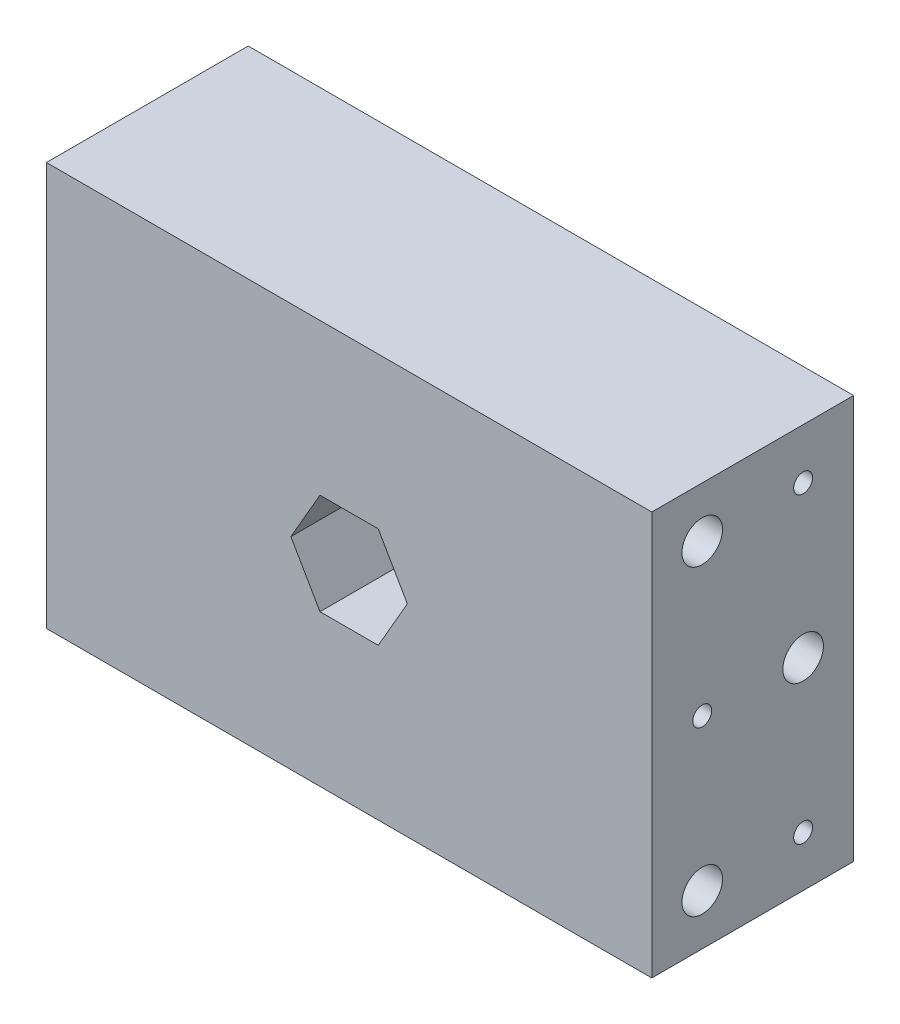
ISO-10303-21;
HEADER;
FILE_DESCRIPTION(('STEP AP214'),'2;1');
FILE_NAME('part.step','',(''),(''),'','','');
FILE_SCHEMA(('AUTOMOTIVE_DESIGN { 1 0 10303 214 1 1 1 1 }'));
ENDSEC;
DATA;
#1=APPLICATION_CONTEXT('core data for automotive mechanical design processes');
#2=APPLICATION_PROTOCOL_DEFINITION('international standard','automotive_design',2000,#1);
#3=PRODUCT_CONTEXT('',#1,'mechanical');
#4=PRODUCT('Part','Part','',(#3));
#5=PRODUCT_RELATED_PRODUCT_CATEGORY('part','',(#4));
#6=PRODUCT_DEFINITION_FORMATION('','',#4);
#7=PRODUCT_DEFINITION_CONTEXT('part definition',#1,'design');
#8=PRODUCT_DEFINITION('design','',#6,#7);
#9=PRODUCT_DEFINITION_SHAPE('','',#8);
#10=(LENGTH_UNIT() NAMED_UNIT(*) SI_UNIT(.MILLI.,.METRE.));
#11=(NAMED_UNIT(*) PLANE_ANGLE_UNIT() SI_UNIT($,.RADIAN.));
#12=(NAMED_UNIT(*) SI_UNIT($,.STERADIAN.) SOLID_ANGLE_UNIT());
#13=UNCERTAINTY_MEASURE_WITH_UNIT(LENGTH_MEASURE(1.E-05),#10,'distance_accuracy_value','');
#14=(GEOMETRIC_REPRESENTATION_CONTEXT(3) GLOBAL_UNCERTAINTY_ASSIGNED_CONTEXT((#13)) GLOBAL_UNIT_ASSIGNED_CONTEXT((#10,
#11,#12)) REPRESENTATION_CONTEXT('',''));
#15=CARTESIAN_POINT('',(0.,0.,0.));
#16=DIRECTION('',(0.,0.,1.));
#17=DIRECTION('',(1.,0.,0.));
#18=AXIS2_PLACEMENT_3D('',#15,#16,#17);
#19=CARTESIAN_POINT('',(0.,-25.4,25.4));
#20=DIRECTION('',(0.,-1.,0.));
#21=DIRECTION('',(1.,0.,0.));
#22=AXIS2_PLACEMENT_3D('',#19,#20,#21);
#23=PLANE('',#22);
#24=DIRECTION('',(-1.,0.,0.));
#25=VECTOR('',#24,1.);
#26=CARTESIAN_POINT('',(0.,-25.4,0.));
#27=LINE('',#26,#25);
#28=CARTESIAN_POINT('',(38.1,-25.4,0.));
#29=VERTEX_POINT('',#28);
#30=CARTESIAN_POINT('',(-38.1,-25.4,0.));
#31=VERTEX_POINT('',#30);
#32=EDGE_CURVE('E222',#29,#31,#27,.T.);
#33=ORIENTED_EDGE('',*,*,#32,.F.);
#34=DIRECTION('',(0.,0.,-1.));
#35=VECTOR('',#34,1.);
#36=CARTESIAN_POINT('',(38.1,-25.4,25.4));
#37=LINE('',#36,#35);
#38=CARTESIAN_POINT('',(38.1,-25.4,25.4));
#39=VERTEX_POINT('',#38);
#40=EDGE_CURVE('E12',#39,#29,#37,.T.);
#41=ORIENTED_EDGE('',*,*,#40,.F.);
#42=DIRECTION('',(-1.,0.,0.));
#43=VECTOR('',#42,1.);
#44=CARTESIAN_POINT('',(0.,-25.4,25.4));
#45=LINE('',#44,#43);
#46=CARTESIAN_POINT('',(-38.1,-25.4,25.4));
#47=VERTEX_POINT('',#46);
#48=EDGE_CURVE('E203',#39,#47,#45,.T.);
#49=ORIENTED_EDGE('',*,*,#48,.T.);
#50=DIRECTION('',(0.,0.,-1.));
#51=VECTOR('',#50,1.);
#52=CARTESIAN_POINT('',(-38.1,-25.4,25.4));
#53=LINE('',#52,#51);
#54=EDGE_CURVE('E221',#47,#31,#53,.T.);
#55=ORIENTED_EDGE('',*,*,#54,.T.);
#56=EDGE_LOOP('',(#33,#41,#49,#55));
#57=FACE_BOUND('',#56,.T.);
#58=ADVANCED_FACE('F44',(#57),#23,.T.);
#59=CARTESIAN_POINT('',(38.1,0.,25.4));
#60=DIRECTION('',(1.,0.,0.));
#61=DIRECTION('',(0.,1.,0.));
#62=AXIS2_PLACEMENT_3D('',#59,#60,#61);
#63=PLANE('',#62);
#64=CARTESIAN_POINT('',(38.1000000000001,19.0499999999999,6.35));
#65=DIRECTION('',(1.,0.,0.));
#66=DIRECTION('',(0.,0.,-1.));
#67=AXIS2_PLACEMENT_3D('',#64,#65,#66);
#68=CIRCLE('',#67,1.19062499999999);
#69=CARTESIAN_POINT('',(38.1000000000001,19.0499999999999,5.15937500000001));
#70=VERTEX_POINT('',#69);
#71=EDGE_CURVE('E405',#70,#70,#68,.T.);
#72=ORIENTED_EDGE('',*,*,#71,.F.);
#73=EDGE_LOOP('',(#72));
#74=FACE_BOUND('',#73,.T.);
#75=CARTESIAN_POINT('',(38.1,-19.0500000000001,6.35));
#76=DIRECTION('',(1.,0.,0.));
#77=DIRECTION('',(0.,0.,-1.));
#78=AXIS2_PLACEMENT_3D('',#75,#76,#77);
#79=CIRCLE('',#78,1.19062499999999);
#80=CARTESIAN_POINT('',(38.1,-19.0500000000001,5.15937500000001));
#81=VERTEX_POINT('',#80);
#82=EDGE_CURVE('E417',#81,#81,#79,.T.);
#83=ORIENTED_EDGE('',*,*,#82,.F.);
#84=EDGE_LOOP('',(#83));
#85=FACE_BOUND('',#84,.T.);
#86=CARTESIAN_POINT('',(38.1000000000001,-1.30104260698261E-13,19.05));
#87=DIRECTION('',(1.,0.,0.));
#88=DIRECTION('',(0.,0.,-1.));
#89=AXIS2_PLACEMENT_3D('',#86,#87,#88);
#90=CIRCLE('',#89,1.19062499999999);
#91=CARTESIAN_POINT('',(38.1000000000001,-1.30104260698261E-13,17.859375));
#92=VERTEX_POINT('',#91);
#93=EDGE_CURVE('E423',#92,#92,#90,.T.);
#94=ORIENTED_EDGE('',*,*,#93,.F.);
#95=EDGE_LOOP('',(#94));
#96=FACE_BOUND('',#95,.T.);
#97=CARTESIAN_POINT('',(38.1000000000001,19.05,19.05));
#98=DIRECTION('',(1.,0.,0.));
#99=DIRECTION('',(0.,0.,-1.));
#100=AXIS2_PLACEMENT_3D('',#97,#98,#99);
#101=CIRCLE('',#100,2.55269999999999);
#102=CARTESIAN_POINT('',(38.1000000000001,19.05,16.4973));
#103=VERTEX_POINT('',#102);
#104=EDGE_CURVE('E429',#103,#103,#101,.T.);
#105=ORIENTED_EDGE('',*,*,#104,.F.);
#106=EDGE_LOOP('',(#105));
#107=FACE_BOUND('',#106,.T.);
#108=CARTESIAN_POINT('',(38.1000000000001,-1.30104260698261E-13,6.35));
#109=DIRECTION('',(1.,0.,0.));
#110=DIRECTION('',(0.,0.,-1.));
#111=AXIS2_PLACEMENT_3D('',#108,#109,#110);
#112=CIRCLE('',#111,2.55269999999999);
#113=CARTESIAN_POINT('',(38.1000000000001,-1.30104260698261E-13,3.79730000000001));
#114=VERTEX_POINT('',#113);
#115=EDGE_CURVE('E435',#114,#114,#112,.T.);
#116=ORIENTED_EDGE('',*,*,#115,.F.);
#117=EDGE_LOOP('',(#116));
#118=FACE_BOUND('',#117,.T.);
#119=CARTESIAN_POINT('',(38.1,-19.05,19.05));
#120=DIRECTION('',(1.,0.,0.));
#121=DIRECTION('',(0.,0.,-1.));
#122=AXIS2_PLACEMENT_3D('',#119,#120,#121);
#123=CIRCLE('',#122,2.55269999999999);
#124=CARTESIAN_POINT('',(38.1,-19.05,16.4973));
#125=VERTEX_POINT('',#124);
#126=EDGE_CURVE('E441',#125,#125,#123,.T.);
#127=ORIENTED_EDGE('',*,*,#126,.F.);
#128=EDGE_LOOP('',(#127));
#129=FACE_BOUND('',#128,.T.);
#130=DIRECTION('',(0.,-1.,0.));
#131=VECTOR('',#130,1.);
#132=CARTESIAN_POINT('',(38.1,0.,0.));
#133=LINE('',#132,#131);
#134=CARTESIAN_POINT('',(38.1,25.4,0.));
#135=VERTEX_POINT('',#134);
#136=EDGE_CURVE('E225',#135,#29,#133,.T.);
#137=ORIENTED_EDGE('',*,*,#136,.F.);
#138=DIRECTION('',(0.,0.,-1.));
#139=VECTOR('',#138,1.);
#140=CARTESIAN_POINT('',(38.1,25.4,25.4));
#141=LINE('',#140,#139);
#142=CARTESIAN_POINT('',(38.1,25.4,25.4));
#143=VERTEX_POINT('',#142);
#144=EDGE_CURVE('E51',#143,#135,#141,.T.);
#145=ORIENTED_EDGE('',*,*,#144,.F.);
#146=DIRECTION('',(0.,-1.,0.));
#147=VECTOR('',#146,1.);
#148=CARTESIAN_POINT('',(38.1,0.,25.4));
#149=LINE('',#148,#147);
#150=EDGE_CURVE('E207',#143,#39,#149,.T.);
#151=ORIENTED_EDGE('',*,*,#150,.T.);
#152=ORIENTED_EDGE('',*,*,#40,.T.);
#153=EDGE_LOOP('',(#137,#145,#151,#152));
#154=FACE_BOUND('',#153,.T.);
#155=ADVANCED_FACE('F242',(#74,#85,#96,#107,#118,#129,#154),#63,.T.);
#156=CARTESIAN_POINT('',(0.,25.4,25.4));
#157=DIRECTION('',(0.,1.,0.));
#158=DIRECTION('',(0.,0.,1.));
#159=AXIS2_PLACEMENT_3D('',#156,#157,#158);
#160=PLANE('',#159);
#161=DIRECTION('',(1.,0.,0.));
#162=VECTOR('',#161,1.);
#163=CARTESIAN_POINT('',(0.,25.4,0.));
#164=LINE('',#163,#162);
#165=CARTESIAN_POINT('',(-38.1000000000002,25.4,0.));
#166=VERTEX_POINT('',#165);
#167=EDGE_CURVE('E228',#166,#135,#164,.T.);
#168=ORIENTED_EDGE('',*,*,#167,.F.);
#169=DIRECTION('',(0.,0.,-1.));
#170=VECTOR('',#169,1.);
#171=CARTESIAN_POINT('',(-38.1000000000002,25.4,25.4));
#172=LINE('',#171,#170);
#173=CARTESIAN_POINT('',(-38.1000000000002,25.4,25.4));
#174=VERTEX_POINT('',#173);
#175=EDGE_CURVE('E234',#174,#166,#172,.T.);
#176=ORIENTED_EDGE('',*,*,#175,.F.);
#177=DIRECTION('',(1.,0.,0.));
#178=VECTOR('',#177,1.);
#179=CARTESIAN_POINT('',(0.,25.4,25.4));
#180=LINE('',#179,#178);
#181=EDGE_CURVE('E214',#174,#143,#180,.T.);
#182=ORIENTED_EDGE('',*,*,#181,.T.);
#183=ORIENTED_EDGE('',*,*,#144,.T.);
#184=EDGE_LOOP('',(#168,#176,#182,#183));
#185=FACE_BOUND('',#184,.T.);
#186=ADVANCED_FACE('F238',(#185),#160,.T.);
#187=CARTESIAN_POINT('',(-38.1000000000001,-1.30104260698261E-13,25.4));
#188=DIRECTION('',(-1.,0.,0.));
#189=DIRECTION('',(0.,-1.,0.));
#190=AXIS2_PLACEMENT_3D('',#187,#188,#189);
#191=PLANE('',#190);
#192=CARTESIAN_POINT('',(-38.1000000000001,19.0499999999999,6.35));
#193=DIRECTION('',(-1.,0.,0.));
#194=DIRECTION('',(0.,0.,1.));
#195=AXIS2_PLACEMENT_3D('',#192,#193,#194);
#196=CIRCLE('',#195,1.19062499999999);
#197=CARTESIAN_POINT('',(-38.1000000000001,19.0499999999999,7.54062499999999));
#198=VERTEX_POINT('',#197);
#199=EDGE_CURVE('E447',#198,#198,#196,.T.);
#200=ORIENTED_EDGE('',*,*,#199,.F.);
#201=EDGE_LOOP('',(#200));
#202=FACE_BOUND('',#201,.T.);
#203=CARTESIAN_POINT('',(-38.1,-19.0500000000001,6.35));
#204=DIRECTION('',(-1.,0.,0.));
#205=DIRECTION('',(0.,0.,1.));
#206=AXIS2_PLACEMENT_3D('',#203,#204,#205);
#207=CIRCLE('',#206,1.19062499999999);
#208=CARTESIAN_POINT('',(-38.1,-19.0500000000001,7.54062499999999));
#209=VERTEX_POINT('',#208);
#210=EDGE_CURVE('E453',#209,#209,#207,.T.);
#211=ORIENTED_EDGE('',*,*,#210,.F.);
#212=EDGE_LOOP('',(#211));
#213=FACE_BOUND('',#212,.T.);
#214=CARTESIAN_POINT('',(-38.1000000000001,-1.30104260698261E-13,19.05));
#215=DIRECTION('',(-1.,0.,0.));
#216=DIRECTION('',(0.,0.,1.));
#217=AXIS2_PLACEMENT_3D('',#214,#215,#216);
#218=CIRCLE('',#217,1.19062499999999);
#219=CARTESIAN_POINT('',(-38.1000000000001,-1.30104260698261E-13,20.240625));
#220=VERTEX_POINT('',#219);
#221=EDGE_CURVE('E459',#220,#220,#218,.T.);
#222=ORIENTED_EDGE('',*,*,#221,.F.);
#223=EDGE_LOOP('',(#222));
#224=FACE_BOUND('',#223,.T.);
#225=CARTESIAN_POINT('',(-38.1000000000001,19.05,19.05));
#226=DIRECTION('',(-1.,0.,0.));
#227=DIRECTION('',(0.,0.,1.));
#228=AXIS2_PLACEMENT_3D('',#225,#226,#227);
#229=CIRCLE('',#228,2.55269999999999);
#230=CARTESIAN_POINT('',(-38.1000000000001,19.05,21.6027));
#231=VERTEX_POINT('',#230);
#232=EDGE_CURVE('E465',#231,#231,#229,.T.);
#233=ORIENTED_EDGE('',*,*,#232,.F.);
#234=EDGE_LOOP('',(#233));
#235=FACE_BOUND('',#234,.T.);
#236=CARTESIAN_POINT('',(-38.1000000000001,-1.30104260698261E-13,6.35));
#237=DIRECTION('',(-1.,0.,0.));
#238=DIRECTION('',(0.,0.,1.));
#239=AXIS2_PLACEMENT_3D('',#236,#237,#238);
#240=CIRCLE('',#239,2.55269999999999);
#241=CARTESIAN_POINT('',(-38.1000000000001,-1.30104260698261E-13,8.90269999999999));
#242=VERTEX_POINT('',#241);
#243=EDGE_CURVE('E471',#242,#242,#240,.T.);
#244=ORIENTED_EDGE('',*,*,#243,.F.);
#245=EDGE_LOOP('',(#244));
#246=FACE_BOUND('',#245,.T.);
#247=CARTESIAN_POINT('',(-38.1,-19.05,19.05));
#248=DIRECTION('',(-1.,0.,0.));
#249=DIRECTION('',(0.,0.,1.));
#250=AXIS2_PLACEMENT_3D('',#247,#248,#249);
#251=CIRCLE('',#250,2.55269999999999);
#252=CARTESIAN_POINT('',(-38.1,-19.05,21.6027));
#253=VERTEX_POINT('',#252);
#254=EDGE_CURVE('E476',#253,#253,#251,.T.);
#255=ORIENTED_EDGE('',*,*,#254,.F.);
#256=EDGE_LOOP('',(#255));
#257=FACE_BOUND('',#256,.T.);
#258=DIRECTION('',(0.,1.,0.));
#259=VECTOR('',#258,1.);
#260=CARTESIAN_POINT('',(-38.1000000000001,-1.30104260698261E-13,0.));
#261=LINE('',#260,#259);
#262=EDGE_CURVE('E208',#31,#166,#261,.T.);
#263=ORIENTED_EDGE('',*,*,#262,.F.);
#264=ORIENTED_EDGE('',*,*,#54,.F.);
#265=DIRECTION('',(0.,1.,0.));
#266=VECTOR('',#265,1.);
#267=CARTESIAN_POINT('',(-38.1000000000001,-1.30104260698261E-13,25.4));
#268=LINE('',#267,#266);
#269=EDGE_CURVE('E217',#47,#174,#268,.T.);
#270=ORIENTED_EDGE('',*,*,#269,.T.);
#271=ORIENTED_EDGE('',*,*,#175,.T.);
#272=EDGE_LOOP('',(#263,#264,#270,#271));
#273=FACE_BOUND('',#272,.T.);
#274=ADVANCED_FACE('F248',(#202,#213,#224,#235,#246,#257,#273),#191,.T.);
#275=CARTESIAN_POINT('',(0.,0.,25.4));
#276=DIRECTION('',(0.,0.,1.));
#277=DIRECTION('',(1.,0.,0.));
#278=AXIS2_PLACEMENT_3D('',#275,#276,#277);
#279=PLANE('',#278);
#280=DIRECTION('',(0.5,0.866025403784438,0.));
#281=VECTOR('',#280,1.);
#282=CARTESIAN_POINT('',(-7.33234841870825,0.,25.4));
#283=LINE('',#282,#281);
#284=CARTESIAN_POINT('',(-7.33234841870825,0.,25.4));
#285=VERTEX_POINT('',#284);
#286=CARTESIAN_POINT('',(-3.66617420935412,6.35,25.4));
#287=VERTEX_POINT('',#286);
#288=EDGE_CURVE('E157',#285,#287,#283,.T.);
#289=ORIENTED_EDGE('',*,*,#288,.T.);
#290=DIRECTION('',(1.,0.,0.));
#291=VECTOR('',#290,1.);
#292=CARTESIAN_POINT('',(-3.66617420935412,6.35,25.4));
#293=LINE('',#292,#291);
#294=CARTESIAN_POINT('',(3.66617420935412,6.35,25.4));
#295=VERTEX_POINT('',#294);
#296=EDGE_CURVE('E166',#287,#295,#293,.T.);
#297=ORIENTED_EDGE('',*,*,#296,.T.);
#298=DIRECTION('',(0.5,-0.866025403784439,0.));
#299=VECTOR('',#298,1.);
#300=CARTESIAN_POINT('',(3.66617420935412,6.35,25.4));
#301=LINE('',#300,#299);
#302=CARTESIAN_POINT('',(7.33234841870824,0.,25.4));
#303=VERTEX_POINT('',#302);
#304=EDGE_CURVE('E58',#295,#303,#301,.T.);
#305=ORIENTED_EDGE('',*,*,#304,.T.);
#306=DIRECTION('',(-0.5,-0.866025403784438,0.));
#307=VECTOR('',#306,1.);
#308=CARTESIAN_POINT('',(7.33234841870824,0.,25.4));
#309=LINE('',#308,#307);
#310=CARTESIAN_POINT('',(3.66617420935412,-6.35,25.4));
#311=VERTEX_POINT('',#310);
#312=EDGE_CURVE('E189',#303,#311,#309,.T.);
#313=ORIENTED_EDGE('',*,*,#312,.T.);
#314=DIRECTION('',(-1.,0.,0.));
#315=VECTOR('',#314,1.);
#316=CARTESIAN_POINT('',(3.66617420935412,-6.35,25.4));
#317=LINE('',#316,#315);
#318=CARTESIAN_POINT('',(-3.66617420935413,-6.35,25.4));
#319=VERTEX_POINT('',#318);
#320=EDGE_CURVE('E193',#311,#319,#317,.T.);
#321=ORIENTED_EDGE('',*,*,#320,.T.);
#322=DIRECTION('',(-0.5,0.866025403784439,0.));
#323=VECTOR('',#322,1.);
#324=CARTESIAN_POINT('',(-3.66617420935413,-6.35,25.4));
#325=LINE('',#324,#323);
#326=EDGE_CURVE('E163',#319,#285,#325,.T.);
#327=ORIENTED_EDGE('',*,*,#326,.T.);
#328=EDGE_LOOP('',(#289,#297,#305,#313,#321,#327));
#329=FACE_BOUND('',#328,.T.);
#330=ORIENTED_EDGE('',*,*,#48,.F.);
#331=ORIENTED_EDGE('',*,*,#150,.F.);
#332=ORIENTED_EDGE('',*,*,#181,.F.);
#333=ORIENTED_EDGE('',*,*,#269,.F.);
#334=EDGE_LOOP('',(#330,#331,#332,#333));
#335=FACE_BOUND('',#334,.T.);
#336=ADVANCED_FACE('F170',(#329,#335),#279,.T.);
#337=CARTESIAN_POINT('',(0.,0.,0.));
#338=DIRECTION('',(0.,0.,1.));
#339=DIRECTION('',(1.,0.,0.));
#340=AXIS2_PLACEMENT_3D('',#337,#338,#339);
#341=PLANE('',#340);
#342=DIRECTION('',(1.,0.,0.));
#343=VECTOR('',#342,1.);
#344=CARTESIAN_POINT('',(-3.66617420935412,6.35,0.));
#345=LINE('',#344,#343);
#346=CARTESIAN_POINT('',(-3.66617420935412,6.35,0.));
#347=VERTEX_POINT('',#346);
#348=CARTESIAN_POINT('',(3.66617420935412,6.35,0.));
#349=VERTEX_POINT('',#348);
#350=EDGE_CURVE('E394',#347,#349,#345,.T.);
#351=ORIENTED_EDGE('',*,*,#350,.F.);
#352=DIRECTION('',(0.5,0.866025403784438,0.));
#353=VECTOR('',#352,1.);
#354=CARTESIAN_POINT('',(-7.33234841870825,0.,0.));
#355=LINE('',#354,#353);
#356=CARTESIAN_POINT('',(-7.33234841870825,0.,0.));
#357=VERTEX_POINT('',#356);
#358=EDGE_CURVE('E66',#357,#347,#355,.T.);
#359=ORIENTED_EDGE('',*,*,#358,.F.);
#360=DIRECTION('',(-0.5,0.866025403784439,0.));
#361=VECTOR('',#360,1.);
#362=CARTESIAN_POINT('',(-3.66617420935413,-6.35,0.));
#363=LINE('',#362,#361);
#364=CARTESIAN_POINT('',(-3.66617420935413,-6.35,0.));
#365=VERTEX_POINT('',#364);
#366=EDGE_CURVE('E174',#365,#357,#363,.T.);
#367=ORIENTED_EDGE('',*,*,#366,.F.);
#368=DIRECTION('',(-1.,0.,0.));
#369=VECTOR('',#368,1.);
#370=CARTESIAN_POINT('',(3.66617420935412,-6.35,0.));
#371=LINE('',#370,#369);
#372=CARTESIAN_POINT('',(3.66617420935412,-6.35,0.));
#373=VERTEX_POINT('',#372);
#374=EDGE_CURVE('E177',#373,#365,#371,.T.);
#375=ORIENTED_EDGE('',*,*,#374,.F.);
#376=DIRECTION('',(-0.5,-0.866025403784438,0.));
#377=VECTOR('',#376,1.);
#378=CARTESIAN_POINT('',(7.33234841870824,0.,0.));
#379=LINE('',#378,#377);
#380=CARTESIAN_POINT('',(7.33234841870824,0.,0.));
#381=VERTEX_POINT('',#380);
#382=EDGE_CURVE('E400',#381,#373,#379,.T.);
#383=ORIENTED_EDGE('',*,*,#382,.F.);
#384=DIRECTION('',(0.5,-0.866025403784439,0.));
#385=VECTOR('',#384,1.);
#386=CARTESIAN_POINT('',(3.66617420935412,6.35,0.));
#387=LINE('',#386,#385);
#388=EDGE_CURVE('E395',#349,#381,#387,.T.);
#389=ORIENTED_EDGE('',*,*,#388,.F.);
#390=EDGE_LOOP('',(#351,#359,#367,#375,#383,#389));
#391=FACE_BOUND('',#390,.T.);
#392=ORIENTED_EDGE('',*,*,#32,.T.);
#393=ORIENTED_EDGE('',*,*,#262,.T.);
#394=ORIENTED_EDGE('',*,*,#167,.T.);
#395=ORIENTED_EDGE('',*,*,#136,.T.);
#396=EDGE_LOOP('',(#392,#393,#394,#395));
#397=FACE_BOUND('',#396,.T.);
#398=ADVANCED_FACE('F245',(#391,#397),#341,.F.);
#399=CARTESIAN_POINT('',(-19.05,-19.05,19.05));
#400=DIRECTION('',(-1.,0.,0.));
#401=DIRECTION('',(0.,0.,1.));
#402=AXIS2_PLACEMENT_3D('',#399,#400,#401);
#403=CONICAL_SURFACE('',#402,2.55269999999999,1.02974425867665);
#404=CARTESIAN_POINT('',(-17.5161830978083,-19.05,19.05));
#405=VERTEX_POINT('',#404);
#406=VERTEX_LOOP('',#405);
#407=FACE_BOUND('',#406,.T.);
#408=CARTESIAN_POINT('',(-19.05,-19.05,19.05));
#409=DIRECTION('',(-1.,0.,0.));
#410=DIRECTION('',(0.,0.,1.));
#411=AXIS2_PLACEMENT_3D('',#408,#409,#410);
#412=CIRCLE('',#411,2.55269999999999);
#413=CARTESIAN_POINT('',(-19.05,-19.05,21.6027));
#414=VERTEX_POINT('',#413);
#415=EDGE_CURVE('E209',#414,#414,#412,.T.);
#416=ORIENTED_EDGE('',*,*,#415,.T.);
#417=EDGE_LOOP('',(#416));
#418=FACE_BOUND('',#417,.T.);
#419=ADVANCED_FACE('F271',(#407,#418),#403,.F.);
#420=CARTESIAN_POINT('',(-38.1,-19.05,19.05));
#421=DIRECTION('',(-1.,0.,0.));
#422=DIRECTION('',(0.,0.,1.));
#423=AXIS2_PLACEMENT_3D('',#420,#421,#422);
#424=CYLINDRICAL_SURFACE('',#423,2.55269999999999);
#425=ORIENTED_EDGE('',*,*,#415,.F.);
#426=EDGE_LOOP('',(#425));
#427=FACE_BOUND('',#426,.T.);
#428=ORIENTED_EDGE('',*,*,#254,.T.);
#429=EDGE_LOOP('',(#428));
#430=FACE_BOUND('',#429,.T.);
#431=ADVANCED_FACE('F277',(#427,#430),#424,.F.);
#432=CARTESIAN_POINT('',(-19.0500000000001,-1.30104260698261E-13,6.35));
#433=DIRECTION('',(-1.,0.,0.));
#434=DIRECTION('',(0.,0.,1.));
#435=AXIS2_PLACEMENT_3D('',#432,#433,#434);
#436=CONICAL_SURFACE('',#435,2.55269999999999,1.02974425867665);
#437=CARTESIAN_POINT('',(-17.5161830978084,-1.35145841794962E-13,6.35));
#438=VERTEX_POINT('',#437);
#439=VERTEX_LOOP('',#438);
#440=FACE_BOUND('',#439,.T.);
#441=CARTESIAN_POINT('',(-19.0500000000001,-1.30104260698261E-13,6.35));
#442=DIRECTION('',(-1.,0.,0.));
#443=DIRECTION('',(0.,0.,1.));
#444=AXIS2_PLACEMENT_3D('',#441,#442,#443);
#445=CIRCLE('',#444,2.55269999999999);
#446=CARTESIAN_POINT('',(-19.0500000000001,-1.30104260698261E-13,8.90269999999999));
#447=VERTEX_POINT('',#446);
#448=EDGE_CURVE('E474',#447,#447,#445,.T.);
#449=ORIENTED_EDGE('',*,*,#448,.T.);
#450=EDGE_LOOP('',(#449));
#451=FACE_BOUND('',#450,.T.);
#452=ADVANCED_FACE('F281',(#440,#451),#436,.F.);
#453=CARTESIAN_POINT('',(-38.1000000000001,-1.30104260698261E-13,6.35));
#454=DIRECTION('',(-1.,0.,0.));
#455=DIRECTION('',(0.,0.,1.));
#456=AXIS2_PLACEMENT_3D('',#453,#454,#455);
#457=CYLINDRICAL_SURFACE('',#456,2.55269999999999);
#458=ORIENTED_EDGE('',*,*,#448,.F.);
#459=EDGE_LOOP('',(#458));
#460=FACE_BOUND('',#459,.T.);
#461=ORIENTED_EDGE('',*,*,#243,.T.);
#462=EDGE_LOOP('',(#461));
#463=FACE_BOUND('',#462,.T.);
#464=ADVANCED_FACE('F285',(#460,#463),#457,.F.);
#465=CARTESIAN_POINT('',(-19.0500000000001,19.05,19.05));
#466=DIRECTION('',(-1.,0.,0.));
#467=DIRECTION('',(0.,0.,1.));
#468=AXIS2_PLACEMENT_3D('',#465,#466,#467);
#469=CONICAL_SURFACE('',#468,2.55269999999999,1.02974425867665);
#470=CARTESIAN_POINT('',(-17.5161830978085,19.05,19.05));
#471=VERTEX_POINT('',#470);
#472=VERTEX_LOOP('',#471);
#473=FACE_BOUND('',#472,.T.);
#474=CARTESIAN_POINT('',(-19.0500000000001,19.05,19.05));
#475=DIRECTION('',(-1.,0.,0.));
#476=DIRECTION('',(0.,0.,1.));
#477=AXIS2_PLACEMENT_3D('',#474,#475,#476);
#478=CIRCLE('',#477,2.55269999999999);
#479=CARTESIAN_POINT('',(-19.0500000000001,19.05,21.6027));
#480=VERTEX_POINT('',#479);
#481=EDGE_CURVE('E468',#480,#480,#478,.T.);
#482=ORIENTED_EDGE('',*,*,#481,.T.);
#483=EDGE_LOOP('',(#482));
#484=FACE_BOUND('',#483,.T.);
#485=ADVANCED_FACE('F289',(#473,#484),#469,.F.);
#486=CARTESIAN_POINT('',(-38.1000000000001,19.05,19.05));
#487=DIRECTION('',(-1.,0.,0.));
#488=DIRECTION('',(0.,0.,1.));
#489=AXIS2_PLACEMENT_3D('',#486,#487,#488);
#490=CYLINDRICAL_SURFACE('',#489,2.55269999999999);
#491=ORIENTED_EDGE('',*,*,#481,.F.);
#492=EDGE_LOOP('',(#491));
#493=FACE_BOUND('',#492,.T.);
#494=ORIENTED_EDGE('',*,*,#232,.T.);
#495=EDGE_LOOP('',(#494));
#496=FACE_BOUND('',#495,.T.);
#497=ADVANCED_FACE('F293',(#493,#496),#490,.F.);
#498=CARTESIAN_POINT('',(-30.1625000000001,-1.30104260698261E-13,19.05));
#499=DIRECTION('',(-1.,0.,0.));
#500=DIRECTION('',(0.,0.,1.));
#501=AXIS2_PLACEMENT_3D('',#498,#499,#500);
#502=CONICAL_SURFACE('',#501,1.190625,1.02974425867665);
#503=CARTESIAN_POINT('',(-29.4471003254704,-1.32223609876212E-13,19.05));
#504=VERTEX_POINT('',#503);
#505=VERTEX_LOOP('',#504);
#506=FACE_BOUND('',#505,.T.);
#507=CARTESIAN_POINT('',(-30.1625000000001,-1.30104260698261E-13,19.05));
#508=DIRECTION('',(-1.,0.,0.));
#509=DIRECTION('',(0.,0.,1.));
#510=AXIS2_PLACEMENT_3D('',#507,#508,#509);
#511=CIRCLE('',#510,1.190625);
#512=CARTESIAN_POINT('',(-30.1625000000001,-1.30104260698261E-13,20.240625));
#513=VERTEX_POINT('',#512);
#514=EDGE_CURVE('E462',#513,#513,#511,.T.);
#515=ORIENTED_EDGE('',*,*,#514,.T.);
#516=EDGE_LOOP('',(#515));
#517=FACE_BOUND('',#516,.T.);
#518=ADVANCED_FACE('F297',(#506,#517),#502,.F.);
#519=CARTESIAN_POINT('',(-38.1000000000001,-1.30104260698261E-13,19.05));
#520=DIRECTION('',(-1.,0.,0.));
#521=DIRECTION('',(0.,0.,1.));
#522=AXIS2_PLACEMENT_3D('',#519,#520,#521);
#523=CYLINDRICAL_SURFACE('',#522,1.19062499999999);
#524=ORIENTED_EDGE('',*,*,#514,.F.);
#525=EDGE_LOOP('',(#524));
#526=FACE_BOUND('',#525,.T.);
#527=ORIENTED_EDGE('',*,*,#221,.T.);
#528=EDGE_LOOP('',(#527));
#529=FACE_BOUND('',#528,.T.);
#530=ADVANCED_FACE('F301',(#526,#529),#523,.F.);
#531=CARTESIAN_POINT('',(-30.1625,-19.0500000000001,6.35));
#532=DIRECTION('',(-1.,0.,0.));
#533=DIRECTION('',(0.,0.,1.));
#534=AXIS2_PLACEMENT_3D('',#531,#532,#533);
#535=CONICAL_SURFACE('',#534,1.190625,1.02974425867665);
#536=CARTESIAN_POINT('',(-29.4471003254703,-19.0500000000001,6.35));
#537=VERTEX_POINT('',#536);
#538=VERTEX_LOOP('',#537);
#539=FACE_BOUND('',#538,.T.);
#540=CARTESIAN_POINT('',(-30.1625,-19.0500000000001,6.35));
#541=DIRECTION('',(-1.,0.,0.));
#542=DIRECTION('',(0.,0.,1.));
#543=AXIS2_PLACEMENT_3D('',#540,#541,#542);
#544=CIRCLE('',#543,1.190625);
#545=CARTESIAN_POINT('',(-30.1625,-19.0500000000001,7.540625));
#546=VERTEX_POINT('',#545);
#547=EDGE_CURVE('E456',#546,#546,#544,.T.);
#548=ORIENTED_EDGE('',*,*,#547,.T.);
#549=EDGE_LOOP('',(#548));
#550=FACE_BOUND('',#549,.T.);
#551=ADVANCED_FACE('F305',(#539,#550),#535,.F.);
#552=CARTESIAN_POINT('',(-38.1,-19.0500000000001,6.35));
#553=DIRECTION('',(-1.,0.,0.));
#554=DIRECTION('',(0.,0.,1.));
#555=AXIS2_PLACEMENT_3D('',#552,#553,#554);
#556=CYLINDRICAL_SURFACE('',#555,1.19062499999999);
#557=ORIENTED_EDGE('',*,*,#547,.F.);
#558=EDGE_LOOP('',(#557));
#559=FACE_BOUND('',#558,.T.);
#560=ORIENTED_EDGE('',*,*,#210,.T.);
#561=EDGE_LOOP('',(#560));
#562=FACE_BOUND('',#561,.T.);
#563=ADVANCED_FACE('F309',(#559,#562),#556,.F.);
#564=CARTESIAN_POINT('',(-30.1625000000001,19.0499999999999,6.35));
#565=DIRECTION('',(-1.,0.,0.));
#566=DIRECTION('',(0.,0.,1.));
#567=AXIS2_PLACEMENT_3D('',#564,#565,#566);
#568=CONICAL_SURFACE('',#567,1.190625,1.02974425867665);
#569=CARTESIAN_POINT('',(-29.4471003254704,19.0499999999999,6.35));
#570=VERTEX_POINT('',#569);
#571=VERTEX_LOOP('',#570);
#572=FACE_BOUND('',#571,.T.);
#573=CARTESIAN_POINT('',(-30.1625000000001,19.0499999999999,6.35));
#574=DIRECTION('',(-1.,0.,0.));
#575=DIRECTION('',(0.,0.,1.));
#576=AXIS2_PLACEMENT_3D('',#573,#574,#575);
#577=CIRCLE('',#576,1.190625);
#578=CARTESIAN_POINT('',(-30.1625000000001,19.0499999999999,7.540625));
#579=VERTEX_POINT('',#578);
#580=EDGE_CURVE('E450',#579,#579,#577,.T.);
#581=ORIENTED_EDGE('',*,*,#580,.T.);
#582=EDGE_LOOP('',(#581));
#583=FACE_BOUND('',#582,.T.);
#584=ADVANCED_FACE('F313',(#572,#583),#568,.F.);
#585=CARTESIAN_POINT('',(-38.1000000000001,19.0499999999999,6.35));
#586=DIRECTION('',(-1.,0.,0.));
#587=DIRECTION('',(0.,0.,1.));
#588=AXIS2_PLACEMENT_3D('',#585,#586,#587);
#589=CYLINDRICAL_SURFACE('',#588,1.19062499999999);
#590=ORIENTED_EDGE('',*,*,#580,.F.);
#591=EDGE_LOOP('',(#590));
#592=FACE_BOUND('',#591,.T.);
#593=ORIENTED_EDGE('',*,*,#199,.T.);
#594=EDGE_LOOP('',(#593));
#595=FACE_BOUND('',#594,.T.);
#596=ADVANCED_FACE('F317',(#592,#595),#589,.F.);
#597=CARTESIAN_POINT('',(19.05,-19.05,19.05));
#598=DIRECTION('',(1.,0.,0.));
#599=DIRECTION('',(0.,0.,-1.));
#600=AXIS2_PLACEMENT_3D('',#597,#598,#599);
#601=CONICAL_SURFACE('',#600,2.55269999999999,1.02974425867665);
#602=CARTESIAN_POINT('',(17.5161830978083,-19.05,19.05));
#603=VERTEX_POINT('',#602);
#604=VERTEX_LOOP('',#603);
#605=FACE_BOUND('',#604,.T.);
#606=CARTESIAN_POINT('',(19.05,-19.05,19.05));
#607=DIRECTION('',(1.,0.,0.));
#608=DIRECTION('',(0.,0.,-1.));
#609=AXIS2_PLACEMENT_3D('',#606,#607,#608);
#610=CIRCLE('',#609,2.55269999999999);
#611=CARTESIAN_POINT('',(19.05,-19.05,16.4973));
#612=VERTEX_POINT('',#611);
#613=EDGE_CURVE('E444',#612,#612,#610,.T.);
#614=ORIENTED_EDGE('',*,*,#613,.T.);
#615=EDGE_LOOP('',(#614));
#616=FACE_BOUND('',#615,.T.);
#617=ADVANCED_FACE('F320',(#605,#616),#601,.F.);
#618=CARTESIAN_POINT('',(38.1,-19.05,19.05));
#619=DIRECTION('',(1.,0.,0.));
#620=DIRECTION('',(0.,0.,-1.));
#621=AXIS2_PLACEMENT_3D('',#618,#619,#620);
#622=CYLINDRICAL_SURFACE('',#621,2.55269999999999);
#623=ORIENTED_EDGE('',*,*,#613,.F.);
#624=EDGE_LOOP('',(#623));
#625=FACE_BOUND('',#624,.T.);
#626=ORIENTED_EDGE('',*,*,#126,.T.);
#627=EDGE_LOOP('',(#626));
#628=FACE_BOUND('',#627,.T.);
#629=ADVANCED_FACE('F323',(#625,#628),#622,.F.);
#630=CARTESIAN_POINT('',(19.0500000000001,-1.30104260698261E-13,6.35));
#631=DIRECTION('',(1.,0.,0.));
#632=DIRECTION('',(0.,0.,-1.));
#633=AXIS2_PLACEMENT_3D('',#630,#631,#632);
#634=CONICAL_SURFACE('',#633,2.55269999999999,1.02974425867665);
#635=CARTESIAN_POINT('',(17.5161830978084,-1.35145841794962E-13,6.35));
#636=VERTEX_POINT('',#635);
#637=VERTEX_LOOP('',#636);
#638=FACE_BOUND('',#637,.T.);
#639=CARTESIAN_POINT('',(19.0500000000001,-1.30104260698261E-13,6.35));
#640=DIRECTION('',(1.,0.,0.));
#641=DIRECTION('',(0.,0.,-1.));
#642=AXIS2_PLACEMENT_3D('',#639,#640,#641);
#643=CIRCLE('',#642,2.55269999999999);
#644=CARTESIAN_POINT('',(19.0500000000001,-1.30104260698261E-13,3.79730000000001));
#645=VERTEX_POINT('',#644);
#646=EDGE_CURVE('E438',#645,#645,#643,.T.);
#647=ORIENTED_EDGE('',*,*,#646,.T.);
#648=EDGE_LOOP('',(#647));
#649=FACE_BOUND('',#648,.T.);
#650=ADVANCED_FACE('F327',(#638,#649),#634,.F.);
#651=CARTESIAN_POINT('',(38.1000000000001,-1.30104260698261E-13,6.35));
#652=DIRECTION('',(1.,0.,0.));
#653=DIRECTION('',(0.,0.,-1.));
#654=AXIS2_PLACEMENT_3D('',#651,#652,#653);
#655=CYLINDRICAL_SURFACE('',#654,2.55269999999999);
#656=ORIENTED_EDGE('',*,*,#646,.F.);
#657=EDGE_LOOP('',(#656));
#658=FACE_BOUND('',#657,.T.);
#659=ORIENTED_EDGE('',*,*,#115,.T.);
#660=EDGE_LOOP('',(#659));
#661=FACE_BOUND('',#660,.T.);
#662=ADVANCED_FACE('F331',(#658,#661),#655,.F.);
#663=CARTESIAN_POINT('',(19.0500000000001,19.05,19.05));
#664=DIRECTION('',(1.,0.,0.));
#665=DIRECTION('',(0.,0.,-1.));
#666=AXIS2_PLACEMENT_3D('',#663,#664,#665);
#667=CONICAL_SURFACE('',#666,2.55269999999999,1.02974425867665);
#668=CARTESIAN_POINT('',(17.5161830978085,19.05,19.05));
#669=VERTEX_POINT('',#668);
#670=VERTEX_LOOP('',#669);
#671=FACE_BOUND('',#670,.T.);
#672=CARTESIAN_POINT('',(19.0500000000001,19.05,19.05));
#673=DIRECTION('',(1.,0.,0.));
#674=DIRECTION('',(0.,0.,-1.));
#675=AXIS2_PLACEMENT_3D('',#672,#673,#674);
#676=CIRCLE('',#675,2.55269999999999);
#677=CARTESIAN_POINT('',(19.0500000000001,19.05,16.4973));
#678=VERTEX_POINT('',#677);
#679=EDGE_CURVE('E432',#678,#678,#676,.T.);
#680=ORIENTED_EDGE('',*,*,#679,.T.);
#681=EDGE_LOOP('',(#680));
#682=FACE_BOUND('',#681,.T.);
#683=ADVANCED_FACE('F335',(#671,#682),#667,.F.);
#684=CARTESIAN_POINT('',(38.1000000000001,19.05,19.05));
#685=DIRECTION('',(1.,0.,0.));
#686=DIRECTION('',(0.,0.,-1.));
#687=AXIS2_PLACEMENT_3D('',#684,#685,#686);
#688=CYLINDRICAL_SURFACE('',#687,2.55269999999999);
#689=ORIENTED_EDGE('',*,*,#679,.F.);
#690=EDGE_LOOP('',(#689));
#691=FACE_BOUND('',#690,.T.);
#692=ORIENTED_EDGE('',*,*,#104,.T.);
#693=EDGE_LOOP('',(#692));
#694=FACE_BOUND('',#693,.T.);
#695=ADVANCED_FACE('F339',(#691,#694),#688,.F.);
#696=CARTESIAN_POINT('',(30.1625000000001,-1.30104260698261E-13,19.05));
#697=DIRECTION('',(1.,0.,0.));
#698=DIRECTION('',(0.,0.,-1.));
#699=AXIS2_PLACEMENT_3D('',#696,#697,#698);
#700=CONICAL_SURFACE('',#699,1.190625,1.02974425867665);
#701=CARTESIAN_POINT('',(29.4471003254704,-1.32223609876212E-13,19.05));
#702=VERTEX_POINT('',#701);
#703=VERTEX_LOOP('',#702);
#704=FACE_BOUND('',#703,.T.);
#705=CARTESIAN_POINT('',(30.1625000000001,-1.30104260698261E-13,19.05));
#706=DIRECTION('',(1.,0.,0.));
#707=DIRECTION('',(0.,0.,-1.));
#708=AXIS2_PLACEMENT_3D('',#705,#706,#707);
#709=CIRCLE('',#708,1.190625);
#710=CARTESIAN_POINT('',(30.1625000000001,-1.30104260698261E-13,17.859375));
#711=VERTEX_POINT('',#710);
#712=EDGE_CURVE('E426',#711,#711,#709,.T.);
#713=ORIENTED_EDGE('',*,*,#712,.T.);
#714=EDGE_LOOP('',(#713));
#715=FACE_BOUND('',#714,.T.);
#716=ADVANCED_FACE('F343',(#704,#715),#700,.F.);
#717=CARTESIAN_POINT('',(38.1000000000001,-1.30104260698261E-13,19.05));
#718=DIRECTION('',(1.,0.,0.));
#719=DIRECTION('',(0.,0.,-1.));
#720=AXIS2_PLACEMENT_3D('',#717,#718,#719);
#721=CYLINDRICAL_SURFACE('',#720,1.19062499999999);
#722=ORIENTED_EDGE('',*,*,#712,.F.);
#723=EDGE_LOOP('',(#722));
#724=FACE_BOUND('',#723,.T.);
#725=ORIENTED_EDGE('',*,*,#93,.T.);
#726=EDGE_LOOP('',(#725));
#727=FACE_BOUND('',#726,.T.);
#728=ADVANCED_FACE('F347',(#724,#727),#721,.F.);
#729=CARTESIAN_POINT('',(30.1625,-19.0500000000001,6.35));
#730=DIRECTION('',(1.,0.,0.));
#731=DIRECTION('',(0.,0.,-1.));
#732=AXIS2_PLACEMENT_3D('',#729,#730,#731);
#733=CONICAL_SURFACE('',#732,1.190625,1.02974425867665);
#734=CARTESIAN_POINT('',(29.4471003254703,-19.0500000000001,6.35));
#735=VERTEX_POINT('',#734);
#736=VERTEX_LOOP('',#735);
#737=FACE_BOUND('',#736,.T.);
#738=CARTESIAN_POINT('',(30.1625,-19.0500000000001,6.35));
#739=DIRECTION('',(1.,0.,0.));
#740=DIRECTION('',(0.,0.,-1.));
#741=AXIS2_PLACEMENT_3D('',#738,#739,#740);
#742=CIRCLE('',#741,1.190625);
#743=CARTESIAN_POINT('',(30.1625,-19.0500000000001,5.159375));
#744=VERTEX_POINT('',#743);
#745=EDGE_CURVE('E420',#744,#744,#742,.T.);
#746=ORIENTED_EDGE('',*,*,#745,.T.);
#747=EDGE_LOOP('',(#746));
#748=FACE_BOUND('',#747,.T.);
#749=ADVANCED_FACE('F351',(#737,#748),#733,.F.);
#750=CARTESIAN_POINT('',(38.1,-19.0500000000001,6.35));
#751=DIRECTION('',(1.,0.,0.));
#752=DIRECTION('',(0.,0.,-1.));
#753=AXIS2_PLACEMENT_3D('',#750,#751,#752);
#754=CYLINDRICAL_SURFACE('',#753,1.19062499999999);
#755=ORIENTED_EDGE('',*,*,#745,.F.);
#756=EDGE_LOOP('',(#755));
#757=FACE_BOUND('',#756,.T.);
#758=ORIENTED_EDGE('',*,*,#82,.T.);
#759=EDGE_LOOP('',(#758));
#760=FACE_BOUND('',#759,.T.);
#761=ADVANCED_FACE('F355',(#757,#760),#754,.F.);
#762=CARTESIAN_POINT('',(30.1625000000001,19.0499999999999,6.35));
#763=DIRECTION('',(1.,0.,0.));
#764=DIRECTION('',(0.,0.,-1.));
#765=AXIS2_PLACEMENT_3D('',#762,#763,#764);
#766=CONICAL_SURFACE('',#765,1.190625,1.02974425867665);
#767=CARTESIAN_POINT('',(29.4471003254704,19.0499999999999,6.35));
#768=VERTEX_POINT('',#767);
#769=VERTEX_LOOP('',#768);
#770=FACE_BOUND('',#769,.T.);
#771=CARTESIAN_POINT('',(30.1625000000001,19.0499999999999,6.35));
#772=DIRECTION('',(1.,0.,0.));
#773=DIRECTION('',(0.,0.,-1.));
#774=AXIS2_PLACEMENT_3D('',#771,#772,#773);
#775=CIRCLE('',#774,1.190625);
#776=CARTESIAN_POINT('',(30.1625000000001,19.0499999999999,5.159375));
#777=VERTEX_POINT('',#776);
#778=EDGE_CURVE('E414',#777,#777,#775,.T.);
#779=ORIENTED_EDGE('',*,*,#778,.T.);
#780=EDGE_LOOP('',(#779));
#781=FACE_BOUND('',#780,.T.);
#782=ADVANCED_FACE('F359',(#770,#781),#766,.F.);
#783=CARTESIAN_POINT('',(38.1000000000001,19.0499999999999,6.35));
#784=DIRECTION('',(1.,0.,0.));
#785=DIRECTION('',(0.,0.,-1.));
#786=AXIS2_PLACEMENT_3D('',#783,#784,#785);
#787=CYLINDRICAL_SURFACE('',#786,1.19062499999999);
#788=ORIENTED_EDGE('',*,*,#778,.F.);
#789=EDGE_LOOP('',(#788));
#790=FACE_BOUND('',#789,.T.);
#791=ORIENTED_EDGE('',*,*,#71,.T.);
#792=EDGE_LOOP('',(#791));
#793=FACE_BOUND('',#792,.T.);
#794=ADVANCED_FACE('F363',(#790,#793),#787,.F.);
#795=CARTESIAN_POINT('',(-7.33234841870825,0.,25.4));
#796=DIRECTION('',(-0.866025403784438,0.5,0.));
#797=DIRECTION('',(-0.5,-0.866025403784439,0.));
#798=AXIS2_PLACEMENT_3D('',#795,#796,#797);
#799=PLANE('',#798);
#800=ORIENTED_EDGE('',*,*,#358,.T.);
#801=DIRECTION('',(0.,0.,-1.));
#802=VECTOR('',#801,1.);
#803=CARTESIAN_POINT('',(-3.66617420935412,6.35,25.4));
#804=LINE('',#803,#802);
#805=EDGE_CURVE('E153',#287,#347,#804,.T.);
#806=ORIENTED_EDGE('',*,*,#805,.F.);
#807=ORIENTED_EDGE('',*,*,#288,.F.);
#808=DIRECTION('',(0.,0.,-1.));
#809=VECTOR('',#808,1.);
#810=CARTESIAN_POINT('',(-7.33234841870825,0.,25.4));
#811=LINE('',#810,#809);
#812=EDGE_CURVE('E389',#285,#357,#811,.T.);
#813=ORIENTED_EDGE('',*,*,#812,.T.);
#814=EDGE_LOOP('',(#800,#806,#807,#813));
#815=FACE_BOUND('',#814,.T.);
#816=ADVANCED_FACE('F155',(#815),#799,.F.);
#817=CARTESIAN_POINT('',(-3.66617420935413,-6.35,25.4));
#818=DIRECTION('',(-0.866025403784439,-0.5,0.));
#819=DIRECTION('',(0.5,-0.866025403784439,0.));
#820=AXIS2_PLACEMENT_3D('',#817,#818,#819);
#821=PLANE('',#820);
#822=ORIENTED_EDGE('',*,*,#366,.T.);
#823=ORIENTED_EDGE('',*,*,#812,.F.);
#824=ORIENTED_EDGE('',*,*,#326,.F.);
#825=DIRECTION('',(0.,0.,-1.));
#826=VECTOR('',#825,1.);
#827=CARTESIAN_POINT('',(-3.66617420935413,-6.35,25.4));
#828=LINE('',#827,#826);
#829=EDGE_CURVE('E390',#319,#365,#828,.T.);
#830=ORIENTED_EDGE('',*,*,#829,.T.);
#831=EDGE_LOOP('',(#822,#823,#824,#830));
#832=FACE_BOUND('',#831,.T.);
#833=ADVANCED_FACE('F370',(#832),#821,.F.);
#834=CARTESIAN_POINT('',(3.66617420935412,-6.35,25.4));
#835=DIRECTION('',(0.,-1.,0.));
#836=DIRECTION('',(1.,0.,0.));
#837=AXIS2_PLACEMENT_3D('',#834,#835,#836);
#838=PLANE('',#837);
#839=ORIENTED_EDGE('',*,*,#374,.T.);
#840=ORIENTED_EDGE('',*,*,#829,.F.);
#841=ORIENTED_EDGE('',*,*,#320,.F.);
#842=DIRECTION('',(0.,0.,-1.));
#843=VECTOR('',#842,1.);
#844=CARTESIAN_POINT('',(3.66617420935412,-6.35,25.4));
#845=LINE('',#844,#843);
#846=EDGE_CURVE('E407',#311,#373,#845,.T.);
#847=ORIENTED_EDGE('',*,*,#846,.T.);
#848=EDGE_LOOP('',(#839,#840,#841,#847));
#849=FACE_BOUND('',#848,.T.);
#850=ADVANCED_FACE('F379',(#849),#838,.F.);
#851=CARTESIAN_POINT('',(7.33234841870824,0.,25.4));
#852=DIRECTION('',(0.866025403784438,-0.5,0.));
#853=DIRECTION('',(0.5,0.866025403784439,0.));
#854=AXIS2_PLACEMENT_3D('',#851,#852,#853);
#855=PLANE('',#854);
#856=ORIENTED_EDGE('',*,*,#382,.T.);
#857=ORIENTED_EDGE('',*,*,#846,.F.);
#858=ORIENTED_EDGE('',*,*,#312,.F.);
#859=DIRECTION('',(0.,0.,-1.));
#860=VECTOR('',#859,1.);
#861=CARTESIAN_POINT('',(7.33234841870824,0.,25.4));
#862=LINE('',#861,#860);
#863=EDGE_CURVE('E409',#303,#381,#862,.T.);
#864=ORIENTED_EDGE('',*,*,#863,.T.);
#865=EDGE_LOOP('',(#856,#857,#858,#864));
#866=FACE_BOUND('',#865,.T.);
#867=ADVANCED_FACE('F376',(#866),#855,.F.);
#868=CARTESIAN_POINT('',(3.66617420935412,6.35,25.4));
#869=DIRECTION('',(0.866025403784439,0.5,0.));
#870=DIRECTION('',(-0.5,0.866025403784439,0.));
#871=AXIS2_PLACEMENT_3D('',#868,#869,#870);
#872=PLANE('',#871);
#873=ORIENTED_EDGE('',*,*,#388,.T.);
#874=ORIENTED_EDGE('',*,*,#863,.F.);
#875=ORIENTED_EDGE('',*,*,#304,.F.);
#876=DIRECTION('',(0.,0.,-1.));
#877=VECTOR('',#876,1.);
#878=CARTESIAN_POINT('',(3.66617420935412,6.35,25.4));
#879=LINE('',#878,#877);
#880=EDGE_CURVE('E162',#295,#349,#879,.T.);
#881=ORIENTED_EDGE('',*,*,#880,.T.);
#882=EDGE_LOOP('',(#873,#874,#875,#881));
#883=FACE_BOUND('',#882,.T.);
#884=ADVANCED_FACE('F373',(#883),#872,.F.);
#885=CARTESIAN_POINT('',(-3.66617420935412,6.35,25.4));
#886=DIRECTION('',(0.,1.,0.));
#887=DIRECTION('',(-1.,0.,0.));
#888=AXIS2_PLACEMENT_3D('',#885,#886,#887);
#889=PLANE('',#888);
#890=ORIENTED_EDGE('',*,*,#350,.T.);
#891=ORIENTED_EDGE('',*,*,#880,.F.);
#892=ORIENTED_EDGE('',*,*,#296,.F.);
#893=ORIENTED_EDGE('',*,*,#805,.T.);
#894=EDGE_LOOP('',(#890,#891,#892,#893));
#895=FACE_BOUND('',#894,.T.);
#896=ADVANCED_FACE('F167',(#895),#889,.F.);
#897=CLOSED_SHELL('',(#58,#155,#186,#274,#336,#398,#419,#431,#452,#464,#485,#497,#518,#530,#551,
#563,#584,#596,#617,#629,#650,#662,#683,#695,#716,#728,#749,#761,#782,#794,#816,#833,#850,#867,
#884,#896));
#898=MANIFOLD_SOLID_BREP('B2',#897);
#899=ADVANCED_BREP_SHAPE_REPRESENTATION('',(#18,#898),#14);
#900=SHAPE_DEFINITION_REPRESENTATION(#9,#899);
ENDSEC;
END-ISO-10303-21;
